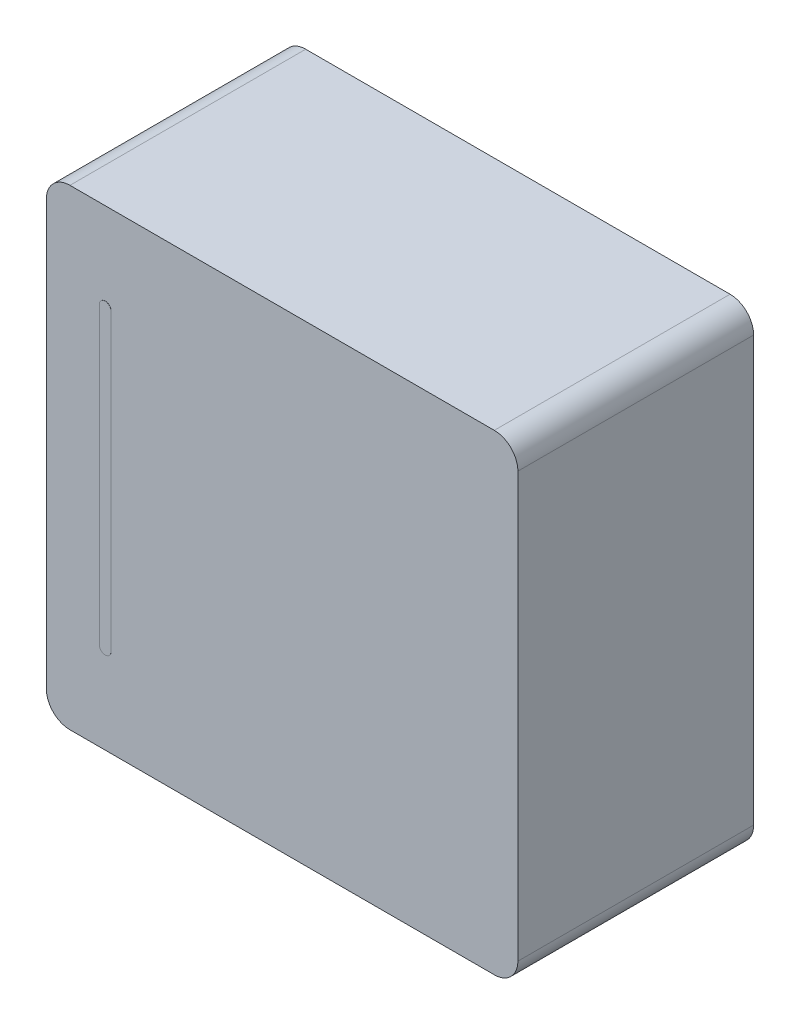
ISO-10303-21;
HEADER;
FILE_DESCRIPTION(('STEP AP214'),'2;1');
FILE_NAME('part.step','',(''),(''),'','','');
FILE_SCHEMA(('AUTOMOTIVE_DESIGN { 1 0 10303 214 1 1 1 1 }'));
ENDSEC;
DATA;
#1=APPLICATION_CONTEXT('core data for automotive mechanical design processes');
#2=APPLICATION_PROTOCOL_DEFINITION('international standard','automotive_design',2000,#1);
#3=PRODUCT_CONTEXT('',#1,'mechanical');
#4=PRODUCT('Part','Part','',(#3));
#5=PRODUCT_RELATED_PRODUCT_CATEGORY('part','',(#4));
#6=PRODUCT_DEFINITION_FORMATION('','',#4);
#7=PRODUCT_DEFINITION_CONTEXT('part definition',#1,'design');
#8=PRODUCT_DEFINITION('design','',#6,#7);
#9=PRODUCT_DEFINITION_SHAPE('','',#8);
#10=(LENGTH_UNIT() NAMED_UNIT(*) SI_UNIT(.MILLI.,.METRE.));
#11=(NAMED_UNIT(*) PLANE_ANGLE_UNIT() SI_UNIT($,.RADIAN.));
#12=(NAMED_UNIT(*) SI_UNIT($,.STERADIAN.) SOLID_ANGLE_UNIT());
#13=UNCERTAINTY_MEASURE_WITH_UNIT(LENGTH_MEASURE(1.E-05),#10,'distance_accuracy_value','');
#14=(GEOMETRIC_REPRESENTATION_CONTEXT(3) GLOBAL_UNCERTAINTY_ASSIGNED_CONTEXT((#13)) GLOBAL_UNIT_ASSIGNED_CONTEXT((#10,
#11,#12)) REPRESENTATION_CONTEXT('',''));
#15=CARTESIAN_POINT('',(0.,0.,0.));
#16=DIRECTION('',(0.,0.,1.));
#17=DIRECTION('',(1.,0.,0.));
#18=AXIS2_PLACEMENT_3D('',#15,#16,#17);
#19=CARTESIAN_POINT('',(1.8,-1.8,2.1));
#20=DIRECTION('',(0.,0.,-1.));
#21=DIRECTION('',(-1.,0.,0.));
#22=AXIS2_PLACEMENT_3D('',#19,#20,#21);
#23=PLANE('',#22);
#24=CARTESIAN_POINT('',(1.8,-1.8,2.1));
#25=DIRECTION('',(0.,0.,1.));
#26=DIRECTION('',(-1.,0.,0.));
#27=AXIS2_PLACEMENT_3D('',#24,#25,#26);
#28=CIRCLE('',#27,0.2);
#29=CARTESIAN_POINT('',(1.8,-2.,2.1));
#30=VERTEX_POINT('',#29);
#31=CARTESIAN_POINT('',(2.,-1.8,2.1));
#32=VERTEX_POINT('',#31);
#33=EDGE_CURVE('E232',#30,#32,#28,.T.);
#34=ORIENTED_EDGE('',*,*,#33,.T.);
#35=DIRECTION('',(0.,1.,0.));
#36=VECTOR('',#35,1.);
#37=CARTESIAN_POINT('',(2.,1.8,2.1));
#38=LINE('',#37,#36);
#39=CARTESIAN_POINT('',(2.,1.8,2.1));
#40=VERTEX_POINT('',#39);
#41=EDGE_CURVE('E235',#32,#40,#38,.T.);
#42=ORIENTED_EDGE('',*,*,#41,.T.);
#43=CARTESIAN_POINT('',(1.8,1.8,2.1));
#44=DIRECTION('',(0.,0.,1.));
#45=DIRECTION('',(-1.,0.,0.));
#46=AXIS2_PLACEMENT_3D('',#43,#44,#45);
#47=CIRCLE('',#46,0.2);
#48=CARTESIAN_POINT('',(1.8,2.,2.1));
#49=VERTEX_POINT('',#48);
#50=EDGE_CURVE('E238',#40,#49,#47,.T.);
#51=ORIENTED_EDGE('',*,*,#50,.T.);
#52=DIRECTION('',(-1.,0.,0.));
#53=VECTOR('',#52,1.);
#54=CARTESIAN_POINT('',(-1.8,2.,2.1));
#55=LINE('',#54,#53);
#56=CARTESIAN_POINT('',(-1.8,2.,2.1));
#57=VERTEX_POINT('',#56);
#58=EDGE_CURVE('E240',#49,#57,#55,.T.);
#59=ORIENTED_EDGE('',*,*,#58,.T.);
#60=CARTESIAN_POINT('',(-1.8,1.8,2.1));
#61=DIRECTION('',(0.,0.,1.));
#62=DIRECTION('',(-1.,0.,0.));
#63=AXIS2_PLACEMENT_3D('',#60,#61,#62);
#64=CIRCLE('',#63,0.2);
#65=CARTESIAN_POINT('',(-2.,1.8,2.1));
#66=VERTEX_POINT('',#65);
#67=EDGE_CURVE('E242',#57,#66,#64,.T.);
#68=ORIENTED_EDGE('',*,*,#67,.T.);
#69=DIRECTION('',(0.,-1.,0.));
#70=VECTOR('',#69,1.);
#71=CARTESIAN_POINT('',(-2.,1.8,2.1));
#72=LINE('',#71,#70);
#73=CARTESIAN_POINT('',(-2.,-1.8,2.1));
#74=VERTEX_POINT('',#73);
#75=EDGE_CURVE('E244',#66,#74,#72,.T.);
#76=ORIENTED_EDGE('',*,*,#75,.T.);
#77=CARTESIAN_POINT('',(-1.8,-1.8,2.1));
#78=DIRECTION('',(0.,0.,1.));
#79=DIRECTION('',(-1.,0.,0.));
#80=AXIS2_PLACEMENT_3D('',#77,#78,#79);
#81=CIRCLE('',#80,0.2);
#82=CARTESIAN_POINT('',(-1.8,-2.,2.1));
#83=VERTEX_POINT('',#82);
#84=EDGE_CURVE('E246',#74,#83,#81,.T.);
#85=ORIENTED_EDGE('',*,*,#84,.T.);
#86=DIRECTION('',(1.,0.,0.));
#87=VECTOR('',#86,1.);
#88=CARTESIAN_POINT('',(-1.8,-2.,2.1));
#89=LINE('',#88,#87);
#90=EDGE_CURVE('E248',#83,#30,#89,.T.);
#91=ORIENTED_EDGE('',*,*,#90,.T.);
#92=EDGE_LOOP('',(#34,#42,#51,#59,#68,#76,#85,#91));
#93=FACE_BOUND('',#92,.T.);
#94=CARTESIAN_POINT('',(-1.5,-1.25,2.1));
#95=DIRECTION('',(0.,0.,1.));
#96=DIRECTION('',(1.,0.,0.));
#97=AXIS2_PLACEMENT_3D('',#94,#95,#96);
#98=CIRCLE('',#97,0.05);
#99=CARTESIAN_POINT('',(-1.55,-1.25,2.1));
#100=VERTEX_POINT('',#99);
#101=CARTESIAN_POINT('',(-1.45,-1.25,2.1));
#102=VERTEX_POINT('',#101);
#103=EDGE_CURVE('E192',#100,#102,#98,.T.);
#104=ORIENTED_EDGE('',*,*,#103,.F.);
#105=DIRECTION('',(0.,-1.,0.));
#106=VECTOR('',#105,1.);
#107=CARTESIAN_POINT('',(-1.55,-1.25,2.1));
#108=LINE('',#107,#106);
#109=CARTESIAN_POINT('',(-1.55,1.25,2.1));
#110=VERTEX_POINT('',#109);
#111=EDGE_CURVE('E189',#110,#100,#108,.T.);
#112=ORIENTED_EDGE('',*,*,#111,.F.);
#113=CARTESIAN_POINT('',(-1.5,1.25,2.1));
#114=DIRECTION('',(0.,0.,1.));
#115=DIRECTION('',(1.,0.,0.));
#116=AXIS2_PLACEMENT_3D('',#113,#114,#115);
#117=CIRCLE('',#116,0.05);
#118=CARTESIAN_POINT('',(-1.45,1.25,2.1));
#119=VERTEX_POINT('',#118);
#120=EDGE_CURVE('E55',#119,#110,#117,.T.);
#121=ORIENTED_EDGE('',*,*,#120,.F.);
#122=DIRECTION('',(0.,1.,0.));
#123=VECTOR('',#122,1.);
#124=CARTESIAN_POINT('',(-1.45,-1.25,2.1));
#125=LINE('',#124,#123);
#126=EDGE_CURVE('E50',#102,#119,#125,.T.);
#127=ORIENTED_EDGE('',*,*,#126,.F.);
#128=EDGE_LOOP('',(#104,#112,#121,#127));
#129=FACE_BOUND('',#128,.T.);
#130=ADVANCED_FACE('F35',(#93,#129),#23,.F.);
#131=CARTESIAN_POINT('',(1.8,-1.8,0.1));
#132=DIRECTION('',(0.,0.,-1.));
#133=DIRECTION('',(-1.,0.,0.));
#134=AXIS2_PLACEMENT_3D('',#131,#132,#133);
#135=PLANE('',#134);
#136=DIRECTION('',(1.,0.,0.));
#137=VECTOR('',#136,1.);
#138=CARTESIAN_POINT('',(-1.675,-1.7,0.1));
#139=LINE('',#138,#137);
#140=CARTESIAN_POINT('',(-1.675,-1.7,0.1));
#141=VERTEX_POINT('',#140);
#142=CARTESIAN_POINT('',(-0.695,-1.7,0.1));
#143=VERTEX_POINT('',#142);
#144=EDGE_CURVE('E300',#141,#143,#139,.T.);
#145=ORIENTED_EDGE('',*,*,#144,.T.);
#146=DIRECTION('',(0.,1.,0.));
#147=VECTOR('',#146,1.);
#148=CARTESIAN_POINT('',(-0.695,-1.7,0.1));
#149=LINE('',#148,#147);
#150=CARTESIAN_POINT('',(-0.695,1.7,0.1));
#151=VERTEX_POINT('',#150);
#152=EDGE_CURVE('E290',#143,#151,#149,.T.);
#153=ORIENTED_EDGE('',*,*,#152,.T.);
#154=DIRECTION('',(-1.,0.,0.));
#155=VECTOR('',#154,1.);
#156=CARTESIAN_POINT('',(-1.675,1.7,0.1));
#157=LINE('',#156,#155);
#158=CARTESIAN_POINT('',(-1.675,1.7,0.1));
#159=VERTEX_POINT('',#158);
#160=EDGE_CURVE('E293',#151,#159,#157,.T.);
#161=ORIENTED_EDGE('',*,*,#160,.T.);
#162=DIRECTION('',(0.,-1.,0.));
#163=VECTOR('',#162,1.);
#164=CARTESIAN_POINT('',(-1.675,-1.7,0.1));
#165=LINE('',#164,#163);
#166=EDGE_CURVE('E297',#159,#141,#165,.T.);
#167=ORIENTED_EDGE('',*,*,#166,.T.);
#168=EDGE_LOOP('',(#145,#153,#161,#167));
#169=FACE_BOUND('',#168,.T.);
#170=CARTESIAN_POINT('',(1.8,-1.8,0.1));
#171=DIRECTION('',(0.,0.,1.));
#172=DIRECTION('',(-1.,0.,0.));
#173=AXIS2_PLACEMENT_3D('',#170,#171,#172);
#174=CIRCLE('',#173,0.2);
#175=CARTESIAN_POINT('',(1.8,-2.,0.1));
#176=VERTEX_POINT('',#175);
#177=CARTESIAN_POINT('',(2.,-1.8,0.1));
#178=VERTEX_POINT('',#177);
#179=EDGE_CURVE('E231',#176,#178,#174,.T.);
#180=ORIENTED_EDGE('',*,*,#179,.F.);
#181=DIRECTION('',(1.,0.,0.));
#182=VECTOR('',#181,1.);
#183=CARTESIAN_POINT('',(-1.8,-2.,0.1));
#184=LINE('',#183,#182);
#185=CARTESIAN_POINT('',(-1.8,-2.,0.1));
#186=VERTEX_POINT('',#185);
#187=EDGE_CURVE('E236',#186,#176,#184,.T.);
#188=ORIENTED_EDGE('',*,*,#187,.F.);
#189=CARTESIAN_POINT('',(-1.8,-1.8,0.1));
#190=DIRECTION('',(0.,0.,1.));
#191=DIRECTION('',(-1.,0.,0.));
#192=AXIS2_PLACEMENT_3D('',#189,#190,#191);
#193=CIRCLE('',#192,0.2);
#194=CARTESIAN_POINT('',(-2.,-1.8,0.1));
#195=VERTEX_POINT('',#194);
#196=EDGE_CURVE('E263',#195,#186,#193,.T.);
#197=ORIENTED_EDGE('',*,*,#196,.F.);
#198=DIRECTION('',(0.,-1.,0.));
#199=VECTOR('',#198,1.);
#200=CARTESIAN_POINT('',(-2.,1.8,0.1));
#201=LINE('',#200,#199);
#202=CARTESIAN_POINT('',(-2.,1.8,0.1));
#203=VERTEX_POINT('',#202);
#204=EDGE_CURVE('E261',#203,#195,#201,.T.);
#205=ORIENTED_EDGE('',*,*,#204,.F.);
#206=CARTESIAN_POINT('',(-1.8,1.8,0.1));
#207=DIRECTION('',(0.,0.,1.));
#208=DIRECTION('',(-1.,0.,0.));
#209=AXIS2_PLACEMENT_3D('',#206,#207,#208);
#210=CIRCLE('',#209,0.2);
#211=CARTESIAN_POINT('',(-1.8,2.,0.1));
#212=VERTEX_POINT('',#211);
#213=EDGE_CURVE('E259',#212,#203,#210,.T.);
#214=ORIENTED_EDGE('',*,*,#213,.F.);
#215=DIRECTION('',(-1.,0.,0.));
#216=VECTOR('',#215,1.);
#217=CARTESIAN_POINT('',(-1.8,2.,0.1));
#218=LINE('',#217,#216);
#219=CARTESIAN_POINT('',(1.8,2.,0.1));
#220=VERTEX_POINT('',#219);
#221=EDGE_CURVE('E257',#220,#212,#218,.T.);
#222=ORIENTED_EDGE('',*,*,#221,.F.);
#223=CARTESIAN_POINT('',(1.8,1.8,0.1));
#224=DIRECTION('',(0.,0.,1.));
#225=DIRECTION('',(-1.,0.,0.));
#226=AXIS2_PLACEMENT_3D('',#223,#224,#225);
#227=CIRCLE('',#226,0.2);
#228=CARTESIAN_POINT('',(2.,1.8,0.1));
#229=VERTEX_POINT('',#228);
#230=EDGE_CURVE('E255',#229,#220,#227,.T.);
#231=ORIENTED_EDGE('',*,*,#230,.F.);
#232=DIRECTION('',(0.,1.,0.));
#233=VECTOR('',#232,1.);
#234=CARTESIAN_POINT('',(2.,1.8,0.1));
#235=LINE('',#234,#233);
#236=EDGE_CURVE('E253',#178,#229,#235,.T.);
#237=ORIENTED_EDGE('',*,*,#236,.F.);
#238=EDGE_LOOP('',(#180,#188,#197,#205,#214,#222,#231,#237));
#239=FACE_BOUND('',#238,.T.);
#240=DIRECTION('',(1.,0.,0.));
#241=VECTOR('',#240,1.);
#242=CARTESIAN_POINT('',(1.675,-1.7,0.1));
#243=LINE('',#242,#241);
#244=CARTESIAN_POINT('',(0.695,-1.7,0.1));
#245=VERTEX_POINT('',#244);
#246=CARTESIAN_POINT('',(1.675,-1.7,0.1));
#247=VERTEX_POINT('',#246);
#248=EDGE_CURVE('E212',#245,#247,#243,.T.);
#249=ORIENTED_EDGE('',*,*,#248,.T.);
#250=DIRECTION('',(0.,1.,0.));
#251=VECTOR('',#250,1.);
#252=CARTESIAN_POINT('',(1.675,-1.7,0.1));
#253=LINE('',#252,#251);
#254=CARTESIAN_POINT('',(1.675,1.7,0.1));
#255=VERTEX_POINT('',#254);
#256=EDGE_CURVE('E202',#247,#255,#253,.T.);
#257=ORIENTED_EDGE('',*,*,#256,.T.);
#258=DIRECTION('',(-1.,0.,0.));
#259=VECTOR('',#258,1.);
#260=CARTESIAN_POINT('',(1.675,1.7,0.1));
#261=LINE('',#260,#259);
#262=CARTESIAN_POINT('',(0.695,1.7,0.1));
#263=VERTEX_POINT('',#262);
#264=EDGE_CURVE('E205',#255,#263,#261,.T.);
#265=ORIENTED_EDGE('',*,*,#264,.T.);
#266=DIRECTION('',(0.,-1.,0.));
#267=VECTOR('',#266,1.);
#268=CARTESIAN_POINT('',(0.695,-1.7,0.1));
#269=LINE('',#268,#267);
#270=EDGE_CURVE('E209',#263,#245,#269,.T.);
#271=ORIENTED_EDGE('',*,*,#270,.T.);
#272=EDGE_LOOP('',(#249,#257,#265,#271));
#273=FACE_BOUND('',#272,.T.);
#274=ADVANCED_FACE('F332',(#169,#239,#273),#135,.T.);
#275=CARTESIAN_POINT('',(-0.695,-1.7,0.1));
#276=DIRECTION('',(-1.,0.,0.));
#277=DIRECTION('',(0.,-1.,0.));
#278=AXIS2_PLACEMENT_3D('',#275,#276,#277);
#279=PLANE('',#278);
#280=DIRECTION('',(0.,1.,0.));
#281=VECTOR('',#280,1.);
#282=CARTESIAN_POINT('',(-0.695,-1.7,0.));
#283=LINE('',#282,#281);
#284=CARTESIAN_POINT('',(-0.695,-1.7,0.));
#285=VERTEX_POINT('',#284);
#286=CARTESIAN_POINT('',(-0.695,1.7,0.));
#287=VERTEX_POINT('',#286);
#288=EDGE_CURVE('E289',#285,#287,#283,.T.);
#289=ORIENTED_EDGE('',*,*,#288,.T.);
#290=DIRECTION('',(0.,0.,-1.));
#291=VECTOR('',#290,1.);
#292=CARTESIAN_POINT('',(-0.695,1.7,0.1));
#293=LINE('',#292,#291);
#294=EDGE_CURVE('E11',#151,#287,#293,.T.);
#295=ORIENTED_EDGE('',*,*,#294,.F.);
#296=ORIENTED_EDGE('',*,*,#152,.F.);
#297=DIRECTION('',(0.,0.,-1.));
#298=VECTOR('',#297,1.);
#299=CARTESIAN_POINT('',(-0.695,-1.7,0.1));
#300=LINE('',#299,#298);
#301=EDGE_CURVE('E303',#143,#285,#300,.T.);
#302=ORIENTED_EDGE('',*,*,#301,.T.);
#303=EDGE_LOOP('',(#289,#295,#296,#302));
#304=FACE_BOUND('',#303,.T.);
#305=ADVANCED_FACE('F37',(#304),#279,.F.);
#306=CARTESIAN_POINT('',(-1.675,1.7,0.1));
#307=DIRECTION('',(0.,-1.,0.));
#308=DIRECTION('',(0.,0.,-1.));
#309=AXIS2_PLACEMENT_3D('',#306,#307,#308);
#310=PLANE('',#309);
#311=DIRECTION('',(-1.,0.,0.));
#312=VECTOR('',#311,1.);
#313=CARTESIAN_POINT('',(-1.675,1.7,0.));
#314=LINE('',#313,#312);
#315=CARTESIAN_POINT('',(-1.675,1.7,0.));
#316=VERTEX_POINT('',#315);
#317=EDGE_CURVE('E306',#287,#316,#314,.T.);
#318=ORIENTED_EDGE('',*,*,#317,.T.);
#319=DIRECTION('',(0.,0.,-1.));
#320=VECTOR('',#319,1.);
#321=CARTESIAN_POINT('',(-1.675,1.7,0.1));
#322=LINE('',#321,#320);
#323=EDGE_CURVE('E43',#159,#316,#322,.T.);
#324=ORIENTED_EDGE('',*,*,#323,.F.);
#325=ORIENTED_EDGE('',*,*,#160,.F.);
#326=ORIENTED_EDGE('',*,*,#294,.T.);
#327=EDGE_LOOP('',(#318,#324,#325,#326));
#328=FACE_BOUND('',#327,.T.);
#329=ADVANCED_FACE('F334',(#328),#310,.F.);
#330=CARTESIAN_POINT('',(-1.675,-1.7,0.1));
#331=DIRECTION('',(1.,0.,0.));
#332=DIRECTION('',(0.,1.,0.));
#333=AXIS2_PLACEMENT_3D('',#330,#331,#332);
#334=PLANE('',#333);
#335=DIRECTION('',(0.,-1.,0.));
#336=VECTOR('',#335,1.);
#337=CARTESIAN_POINT('',(-1.675,-1.7,0.));
#338=LINE('',#337,#336);
#339=CARTESIAN_POINT('',(-1.675,-1.7,0.));
#340=VERTEX_POINT('',#339);
#341=EDGE_CURVE('E308',#316,#340,#338,.T.);
#342=ORIENTED_EDGE('',*,*,#341,.T.);
#343=DIRECTION('',(0.,0.,-1.));
#344=VECTOR('',#343,1.);
#345=CARTESIAN_POINT('',(-1.675,-1.7,0.1));
#346=LINE('',#345,#344);
#347=EDGE_CURVE('E313',#141,#340,#346,.T.);
#348=ORIENTED_EDGE('',*,*,#347,.F.);
#349=ORIENTED_EDGE('',*,*,#166,.F.);
#350=ORIENTED_EDGE('',*,*,#323,.T.);
#351=EDGE_LOOP('',(#342,#348,#349,#350));
#352=FACE_BOUND('',#351,.T.);
#353=ADVANCED_FACE('F319',(#352),#334,.F.);
#354=CARTESIAN_POINT('',(-1.675,-1.7,0.1));
#355=DIRECTION('',(0.,1.,0.));
#356=DIRECTION('',(-1.,0.,0.));
#357=AXIS2_PLACEMENT_3D('',#354,#355,#356);
#358=PLANE('',#357);
#359=DIRECTION('',(1.,0.,0.));
#360=VECTOR('',#359,1.);
#361=CARTESIAN_POINT('',(-1.675,-1.7,0.));
#362=LINE('',#361,#360);
#363=EDGE_CURVE('E294',#340,#285,#362,.T.);
#364=ORIENTED_EDGE('',*,*,#363,.T.);
#365=ORIENTED_EDGE('',*,*,#301,.F.);
#366=ORIENTED_EDGE('',*,*,#144,.F.);
#367=ORIENTED_EDGE('',*,*,#347,.T.);
#368=EDGE_LOOP('',(#364,#365,#366,#367));
#369=FACE_BOUND('',#368,.T.);
#370=ADVANCED_FACE('F327',(#369),#358,.F.);
#371=CARTESIAN_POINT('',(0.,0.,0.));
#372=DIRECTION('',(0.,0.,-1.));
#373=DIRECTION('',(-1.,0.,0.));
#374=AXIS2_PLACEMENT_3D('',#371,#372,#373);
#375=PLANE('',#374);
#376=ORIENTED_EDGE('',*,*,#288,.F.);
#377=ORIENTED_EDGE('',*,*,#363,.F.);
#378=ORIENTED_EDGE('',*,*,#341,.F.);
#379=ORIENTED_EDGE('',*,*,#317,.F.);
#380=EDGE_LOOP('',(#376,#377,#378,#379));
#381=FACE_BOUND('',#380,.T.);
#382=ADVANCED_FACE('F324',(#381),#375,.T.);
#383=CARTESIAN_POINT('',(1.8,-1.8,2.1));
#384=DIRECTION('',(0.,0.,-1.));
#385=DIRECTION('',(-1.,0.,0.));
#386=AXIS2_PLACEMENT_3D('',#383,#384,#385);
#387=CYLINDRICAL_SURFACE('',#386,0.2);
#388=ORIENTED_EDGE('',*,*,#179,.T.);
#389=DIRECTION('',(0.,0.,-1.));
#390=VECTOR('',#389,1.);
#391=CARTESIAN_POINT('',(2.,-1.8,2.1));
#392=LINE('',#391,#390);
#393=EDGE_CURVE('E286',#32,#178,#392,.T.);
#394=ORIENTED_EDGE('',*,*,#393,.F.);
#395=ORIENTED_EDGE('',*,*,#33,.F.);
#396=DIRECTION('',(0.,0.,-1.));
#397=VECTOR('',#396,1.);
#398=CARTESIAN_POINT('',(1.8,-2.,2.1));
#399=LINE('',#398,#397);
#400=EDGE_CURVE('E250',#30,#176,#399,.T.);
#401=ORIENTED_EDGE('',*,*,#400,.T.);
#402=EDGE_LOOP('',(#388,#394,#395,#401));
#403=FACE_BOUND('',#402,.T.);
#404=ADVANCED_FACE('F379',(#403),#387,.T.);
#405=CARTESIAN_POINT('',(2.,1.8,2.1));
#406=DIRECTION('',(-1.,0.,0.));
#407=DIRECTION('',(0.,-1.,0.));
#408=AXIS2_PLACEMENT_3D('',#405,#406,#407);
#409=PLANE('',#408);
#410=ORIENTED_EDGE('',*,*,#236,.T.);
#411=DIRECTION('',(0.,0.,-1.));
#412=VECTOR('',#411,1.);
#413=CARTESIAN_POINT('',(2.,1.8,2.1));
#414=LINE('',#413,#412);
#415=EDGE_CURVE('E283',#40,#229,#414,.T.);
#416=ORIENTED_EDGE('',*,*,#415,.F.);
#417=ORIENTED_EDGE('',*,*,#41,.F.);
#418=ORIENTED_EDGE('',*,*,#393,.T.);
#419=EDGE_LOOP('',(#410,#416,#417,#418));
#420=FACE_BOUND('',#419,.T.);
#421=ADVANCED_FACE('F375',(#420),#409,.F.);
#422=CARTESIAN_POINT('',(1.8,1.8,2.1));
#423=DIRECTION('',(0.,0.,-1.));
#424=DIRECTION('',(-1.,0.,0.));
#425=AXIS2_PLACEMENT_3D('',#422,#423,#424);
#426=CYLINDRICAL_SURFACE('',#425,0.2);
#427=ORIENTED_EDGE('',*,*,#230,.T.);
#428=DIRECTION('',(0.,0.,-1.));
#429=VECTOR('',#428,1.);
#430=CARTESIAN_POINT('',(1.8,2.,2.1));
#431=LINE('',#430,#429);
#432=EDGE_CURVE('E280',#49,#220,#431,.T.);
#433=ORIENTED_EDGE('',*,*,#432,.F.);
#434=ORIENTED_EDGE('',*,*,#50,.F.);
#435=ORIENTED_EDGE('',*,*,#415,.T.);
#436=EDGE_LOOP('',(#427,#433,#434,#435));
#437=FACE_BOUND('',#436,.T.);
#438=ADVANCED_FACE('F371',(#437),#426,.T.);
#439=CARTESIAN_POINT('',(-1.8,2.,2.1));
#440=DIRECTION('',(0.,-1.,0.));
#441=DIRECTION('',(0.,0.,-1.));
#442=AXIS2_PLACEMENT_3D('',#439,#440,#441);
#443=PLANE('',#442);
#444=ORIENTED_EDGE('',*,*,#221,.T.);
#445=DIRECTION('',(0.,0.,-1.));
#446=VECTOR('',#445,1.);
#447=CARTESIAN_POINT('',(-1.8,2.,2.1));
#448=LINE('',#447,#446);
#449=EDGE_CURVE('E277',#57,#212,#448,.T.);
#450=ORIENTED_EDGE('',*,*,#449,.F.);
#451=ORIENTED_EDGE('',*,*,#58,.F.);
#452=ORIENTED_EDGE('',*,*,#432,.T.);
#453=EDGE_LOOP('',(#444,#450,#451,#452));
#454=FACE_BOUND('',#453,.T.);
#455=ADVANCED_FACE('F367',(#454),#443,.F.);
#456=CARTESIAN_POINT('',(-1.8,1.8,2.1));
#457=DIRECTION('',(0.,0.,-1.));
#458=DIRECTION('',(-1.,0.,0.));
#459=AXIS2_PLACEMENT_3D('',#456,#457,#458);
#460=CYLINDRICAL_SURFACE('',#459,0.2);
#461=ORIENTED_EDGE('',*,*,#213,.T.);
#462=DIRECTION('',(0.,0.,-1.));
#463=VECTOR('',#462,1.);
#464=CARTESIAN_POINT('',(-2.,1.8,2.1));
#465=LINE('',#464,#463);
#466=EDGE_CURVE('E274',#66,#203,#465,.T.);
#467=ORIENTED_EDGE('',*,*,#466,.F.);
#468=ORIENTED_EDGE('',*,*,#67,.F.);
#469=ORIENTED_EDGE('',*,*,#449,.T.);
#470=EDGE_LOOP('',(#461,#467,#468,#469));
#471=FACE_BOUND('',#470,.T.);
#472=ADVANCED_FACE('F363',(#471),#460,.T.);
#473=CARTESIAN_POINT('',(-2.,1.8,2.1));
#474=DIRECTION('',(1.,0.,0.));
#475=DIRECTION('',(0.,1.,0.));
#476=AXIS2_PLACEMENT_3D('',#473,#474,#475);
#477=PLANE('',#476);
#478=ORIENTED_EDGE('',*,*,#204,.T.);
#479=DIRECTION('',(0.,0.,-1.));
#480=VECTOR('',#479,1.);
#481=CARTESIAN_POINT('',(-2.,-1.8,2.1));
#482=LINE('',#481,#480);
#483=EDGE_CURVE('E271',#74,#195,#482,.T.);
#484=ORIENTED_EDGE('',*,*,#483,.F.);
#485=ORIENTED_EDGE('',*,*,#75,.F.);
#486=ORIENTED_EDGE('',*,*,#466,.T.);
#487=EDGE_LOOP('',(#478,#484,#485,#486));
#488=FACE_BOUND('',#487,.T.);
#489=ADVANCED_FACE('F359',(#488),#477,.F.);
#490=CARTESIAN_POINT('',(-1.8,-1.8,2.1));
#491=DIRECTION('',(0.,0.,-1.));
#492=DIRECTION('',(-1.,0.,0.));
#493=AXIS2_PLACEMENT_3D('',#490,#491,#492);
#494=CYLINDRICAL_SURFACE('',#493,0.2);
#495=ORIENTED_EDGE('',*,*,#196,.T.);
#496=DIRECTION('',(0.,0.,-1.));
#497=VECTOR('',#496,1.);
#498=CARTESIAN_POINT('',(-1.8,-2.,2.1));
#499=LINE('',#498,#497);
#500=EDGE_CURVE('E268',#83,#186,#499,.T.);
#501=ORIENTED_EDGE('',*,*,#500,.F.);
#502=ORIENTED_EDGE('',*,*,#84,.F.);
#503=ORIENTED_EDGE('',*,*,#483,.T.);
#504=EDGE_LOOP('',(#495,#501,#502,#503));
#505=FACE_BOUND('',#504,.T.);
#506=ADVANCED_FACE('F355',(#505),#494,.T.);
#507=CARTESIAN_POINT('',(-1.8,-2.,2.1));
#508=DIRECTION('',(0.,1.,0.));
#509=DIRECTION('',(0.,0.,1.));
#510=AXIS2_PLACEMENT_3D('',#507,#508,#509);
#511=PLANE('',#510);
#512=ORIENTED_EDGE('',*,*,#187,.T.);
#513=ORIENTED_EDGE('',*,*,#400,.F.);
#514=ORIENTED_EDGE('',*,*,#90,.F.);
#515=ORIENTED_EDGE('',*,*,#500,.T.);
#516=EDGE_LOOP('',(#512,#513,#514,#515));
#517=FACE_BOUND('',#516,.T.);
#518=ADVANCED_FACE('F352',(#517),#511,.F.);
#519=CARTESIAN_POINT('',(1.675,-1.7,0.1));
#520=DIRECTION('',(-1.,0.,0.));
#521=DIRECTION('',(0.,0.,1.));
#522=AXIS2_PLACEMENT_3D('',#519,#520,#521);
#523=PLANE('',#522);
#524=DIRECTION('',(0.,1.,0.));
#525=VECTOR('',#524,1.);
#526=CARTESIAN_POINT('',(1.675,-1.7,0.));
#527=LINE('',#526,#525);
#528=CARTESIAN_POINT('',(1.675,-1.7,0.));
#529=VERTEX_POINT('',#528);
#530=CARTESIAN_POINT('',(1.675,1.7,0.));
#531=VERTEX_POINT('',#530);
#532=EDGE_CURVE('E193',#529,#531,#527,.T.);
#533=ORIENTED_EDGE('',*,*,#532,.T.);
#534=DIRECTION('',(0.,0.,-1.));
#535=VECTOR('',#534,1.);
#536=CARTESIAN_POINT('',(1.675,1.7,0.1));
#537=LINE('',#536,#535);
#538=EDGE_CURVE('E228',#255,#531,#537,.T.);
#539=ORIENTED_EDGE('',*,*,#538,.F.);
#540=ORIENTED_EDGE('',*,*,#256,.F.);
#541=DIRECTION('',(0.,0.,-1.));
#542=VECTOR('',#541,1.);
#543=CARTESIAN_POINT('',(1.675,-1.7,0.1));
#544=LINE('',#543,#542);
#545=EDGE_CURVE('E214',#247,#529,#544,.T.);
#546=ORIENTED_EDGE('',*,*,#545,.T.);
#547=EDGE_LOOP('',(#533,#539,#540,#546));
#548=FACE_BOUND('',#547,.T.);
#549=ADVANCED_FACE('F349',(#548),#523,.F.);
#550=CARTESIAN_POINT('',(1.675,1.7,0.1));
#551=DIRECTION('',(0.,-1.,0.));
#552=DIRECTION('',(0.,0.,-1.));
#553=AXIS2_PLACEMENT_3D('',#550,#551,#552);
#554=PLANE('',#553);
#555=DIRECTION('',(-1.,0.,0.));
#556=VECTOR('',#555,1.);
#557=CARTESIAN_POINT('',(1.675,1.7,0.));
#558=LINE('',#557,#556);
#559=CARTESIAN_POINT('',(0.695,1.7,0.));
#560=VERTEX_POINT('',#559);
#561=EDGE_CURVE('E196',#531,#560,#558,.T.);
#562=ORIENTED_EDGE('',*,*,#561,.T.);
#563=DIRECTION('',(0.,0.,-1.));
#564=VECTOR('',#563,1.);
#565=CARTESIAN_POINT('',(0.695,1.7,0.1));
#566=LINE('',#565,#564);
#567=EDGE_CURVE('E225',#263,#560,#566,.T.);
#568=ORIENTED_EDGE('',*,*,#567,.F.);
#569=ORIENTED_EDGE('',*,*,#264,.F.);
#570=ORIENTED_EDGE('',*,*,#538,.T.);
#571=EDGE_LOOP('',(#562,#568,#569,#570));
#572=FACE_BOUND('',#571,.T.);
#573=ADVANCED_FACE('F434',(#572),#554,.F.);
#574=CARTESIAN_POINT('',(0.695,-1.7,0.1));
#575=DIRECTION('',(1.,0.,0.));
#576=DIRECTION('',(0.,1.,0.));
#577=AXIS2_PLACEMENT_3D('',#574,#575,#576);
#578=PLANE('',#577);
#579=DIRECTION('',(0.,-1.,0.));
#580=VECTOR('',#579,1.);
#581=CARTESIAN_POINT('',(0.695,-1.7,0.));
#582=LINE('',#581,#580);
#583=CARTESIAN_POINT('',(0.695,-1.7,0.));
#584=VERTEX_POINT('',#583);
#585=EDGE_CURVE('E217',#560,#584,#582,.T.);
#586=ORIENTED_EDGE('',*,*,#585,.T.);
#587=DIRECTION('',(0.,0.,-1.));
#588=VECTOR('',#587,1.);
#589=CARTESIAN_POINT('',(0.695,-1.7,0.1));
#590=LINE('',#589,#588);
#591=EDGE_CURVE('E222',#245,#584,#590,.T.);
#592=ORIENTED_EDGE('',*,*,#591,.F.);
#593=ORIENTED_EDGE('',*,*,#270,.F.);
#594=ORIENTED_EDGE('',*,*,#567,.T.);
#595=EDGE_LOOP('',(#586,#592,#593,#594));
#596=FACE_BOUND('',#595,.T.);
#597=ADVANCED_FACE('F441',(#596),#578,.F.);
#598=CARTESIAN_POINT('',(1.675,-1.7,0.1));
#599=DIRECTION('',(0.,1.,0.));
#600=DIRECTION('',(0.,0.,1.));
#601=AXIS2_PLACEMENT_3D('',#598,#599,#600);
#602=PLANE('',#601);
#603=DIRECTION('',(1.,0.,0.));
#604=VECTOR('',#603,1.);
#605=CARTESIAN_POINT('',(1.675,-1.7,0.));
#606=LINE('',#605,#604);
#607=EDGE_CURVE('E206',#584,#529,#606,.T.);
#608=ORIENTED_EDGE('',*,*,#607,.T.);
#609=ORIENTED_EDGE('',*,*,#545,.F.);
#610=ORIENTED_EDGE('',*,*,#248,.F.);
#611=ORIENTED_EDGE('',*,*,#591,.T.);
#612=EDGE_LOOP('',(#608,#609,#610,#611));
#613=FACE_BOUND('',#612,.T.);
#614=ADVANCED_FACE('F448',(#613),#602,.F.);
#615=CARTESIAN_POINT('',(0.,0.,0.));
#616=DIRECTION('',(0.,0.,1.));
#617=DIRECTION('',(1.,0.,0.));
#618=AXIS2_PLACEMENT_3D('',#615,#616,#617);
#619=PLANE('',#618);
#620=ORIENTED_EDGE('',*,*,#532,.F.);
#621=ORIENTED_EDGE('',*,*,#607,.F.);
#622=ORIENTED_EDGE('',*,*,#585,.F.);
#623=ORIENTED_EDGE('',*,*,#561,.F.);
#624=EDGE_LOOP('',(#620,#621,#622,#623));
#625=FACE_BOUND('',#624,.T.);
#626=ADVANCED_FACE('F456',(#625),#619,.F.);
#627=CARTESIAN_POINT('',(-1.5,-1.25,2.101));
#628=DIRECTION('',(0.,0.,-1.));
#629=DIRECTION('',(-1.,0.,0.));
#630=AXIS2_PLACEMENT_3D('',#627,#628,#629);
#631=CYLINDRICAL_SURFACE('',#630,0.05);
#632=ORIENTED_EDGE('',*,*,#103,.T.);
#633=DIRECTION('',(0.,0.,-1.));
#634=VECTOR('',#633,1.);
#635=CARTESIAN_POINT('',(-1.45,-1.25,2.101));
#636=LINE('',#635,#634);
#637=CARTESIAN_POINT('',(-1.45,-1.25,2.101));
#638=VERTEX_POINT('',#637);
#639=EDGE_CURVE('E173',#638,#102,#636,.T.);
#640=ORIENTED_EDGE('',*,*,#639,.F.);
#641=CARTESIAN_POINT('',(-1.5,-1.25,2.101));
#642=DIRECTION('',(0.,0.,1.));
#643=DIRECTION('',(1.,0.,0.));
#644=AXIS2_PLACEMENT_3D('',#641,#642,#643);
#645=CIRCLE('',#644,0.05);
#646=CARTESIAN_POINT('',(-1.55,-1.25,2.101));
#647=VERTEX_POINT('',#646);
#648=EDGE_CURVE('E180',#647,#638,#645,.T.);
#649=ORIENTED_EDGE('',*,*,#648,.F.);
#650=DIRECTION('',(0.,0.,-1.));
#651=VECTOR('',#650,1.);
#652=CARTESIAN_POINT('',(-1.55,-1.25,2.101));
#653=LINE('',#652,#651);
#654=EDGE_CURVE('E566',#647,#100,#653,.T.);
#655=ORIENTED_EDGE('',*,*,#654,.T.);
#656=EDGE_LOOP('',(#632,#640,#649,#655));
#657=FACE_BOUND('',#656,.T.);
#658=ADVANCED_FACE('F191',(#657),#631,.T.);
#659=CARTESIAN_POINT('',(-1.45,-1.25,2.101));
#660=DIRECTION('',(-1.,0.,0.));
#661=DIRECTION('',(0.,0.,1.));
#662=AXIS2_PLACEMENT_3D('',#659,#660,#661);
#663=PLANE('',#662);
#664=ORIENTED_EDGE('',*,*,#126,.T.);
#665=DIRECTION('',(0.,0.,-1.));
#666=VECTOR('',#665,1.);
#667=CARTESIAN_POINT('',(-1.45,1.25,2.101));
#668=LINE('',#667,#666);
#669=CARTESIAN_POINT('',(-1.45,1.25,2.101));
#670=VERTEX_POINT('',#669);
#671=EDGE_CURVE('E176',#670,#119,#668,.T.);
#672=ORIENTED_EDGE('',*,*,#671,.F.);
#673=DIRECTION('',(0.,1.,0.));
#674=VECTOR('',#673,1.);
#675=CARTESIAN_POINT('',(-1.45,-1.25,2.101));
#676=LINE('',#675,#674);
#677=EDGE_CURVE('E169',#638,#670,#676,.T.);
#678=ORIENTED_EDGE('',*,*,#677,.F.);
#679=ORIENTED_EDGE('',*,*,#639,.T.);
#680=EDGE_LOOP('',(#664,#672,#678,#679));
#681=FACE_BOUND('',#680,.T.);
#682=ADVANCED_FACE('F171',(#681),#663,.F.);
#683=CARTESIAN_POINT('',(-1.5,1.25,2.101));
#684=DIRECTION('',(0.,0.,-1.));
#685=DIRECTION('',(-1.,0.,0.));
#686=AXIS2_PLACEMENT_3D('',#683,#684,#685);
#687=CYLINDRICAL_SURFACE('',#686,0.05);
#688=ORIENTED_EDGE('',*,*,#120,.T.);
#689=DIRECTION('',(0.,0.,-1.));
#690=VECTOR('',#689,1.);
#691=CARTESIAN_POINT('',(-1.55,1.25,2.101));
#692=LINE('',#691,#690);
#693=CARTESIAN_POINT('',(-1.55,1.25,2.101));
#694=VERTEX_POINT('',#693);
#695=EDGE_CURVE('E198',#694,#110,#692,.T.);
#696=ORIENTED_EDGE('',*,*,#695,.F.);
#697=CARTESIAN_POINT('',(-1.5,1.25,2.101));
#698=DIRECTION('',(0.,0.,1.));
#699=DIRECTION('',(1.,0.,0.));
#700=AXIS2_PLACEMENT_3D('',#697,#698,#699);
#701=CIRCLE('',#700,0.05);
#702=EDGE_CURVE('E179',#670,#694,#701,.T.);
#703=ORIENTED_EDGE('',*,*,#702,.F.);
#704=ORIENTED_EDGE('',*,*,#671,.T.);
#705=EDGE_LOOP('',(#688,#696,#703,#704));
#706=FACE_BOUND('',#705,.T.);
#707=ADVANCED_FACE('F477',(#706),#687,.T.);
#708=CARTESIAN_POINT('',(-1.55,-1.25,2.101));
#709=DIRECTION('',(1.,0.,0.));
#710=DIRECTION('',(0.,0.,-1.));
#711=AXIS2_PLACEMENT_3D('',#708,#709,#710);
#712=PLANE('',#711);
#713=ORIENTED_EDGE('',*,*,#111,.T.);
#714=ORIENTED_EDGE('',*,*,#654,.F.);
#715=DIRECTION('',(0.,-1.,0.));
#716=VECTOR('',#715,1.);
#717=CARTESIAN_POINT('',(-1.55,-1.25,2.101));
#718=LINE('',#717,#716);
#719=EDGE_CURVE('E185',#694,#647,#718,.T.);
#720=ORIENTED_EDGE('',*,*,#719,.F.);
#721=ORIENTED_EDGE('',*,*,#695,.T.);
#722=EDGE_LOOP('',(#713,#714,#720,#721));
#723=FACE_BOUND('',#722,.T.);
#724=ADVANCED_FACE('F484',(#723),#712,.F.);
#725=CARTESIAN_POINT('',(-1.5,-1.25,2.101));
#726=DIRECTION('',(0.,0.,1.));
#727=DIRECTION('',(1.,0.,0.));
#728=AXIS2_PLACEMENT_3D('',#725,#726,#727);
#729=PLANE('',#728);
#730=ORIENTED_EDGE('',*,*,#648,.T.);
#731=ORIENTED_EDGE('',*,*,#677,.T.);
#732=ORIENTED_EDGE('',*,*,#702,.T.);
#733=ORIENTED_EDGE('',*,*,#719,.T.);
#734=EDGE_LOOP('',(#730,#731,#732,#733));
#735=FACE_BOUND('',#734,.T.);
#736=ADVANCED_FACE('F183',(#735),#729,.T.);
#737=CLOSED_SHELL('',(#130,#274,#305,#329,#353,#370,#382,#404,#421,#438,#455,#472,#489,#506,
#518,#549,#573,#597,#614,#626,#658,#682,#707,#724,#736));
#738=MANIFOLD_SOLID_BREP('B2',#737);
#739=ADVANCED_BREP_SHAPE_REPRESENTATION('',(#18,#738),#14);
#740=SHAPE_DEFINITION_REPRESENTATION(#9,#739);
ENDSEC;
END-ISO-10303-21;
